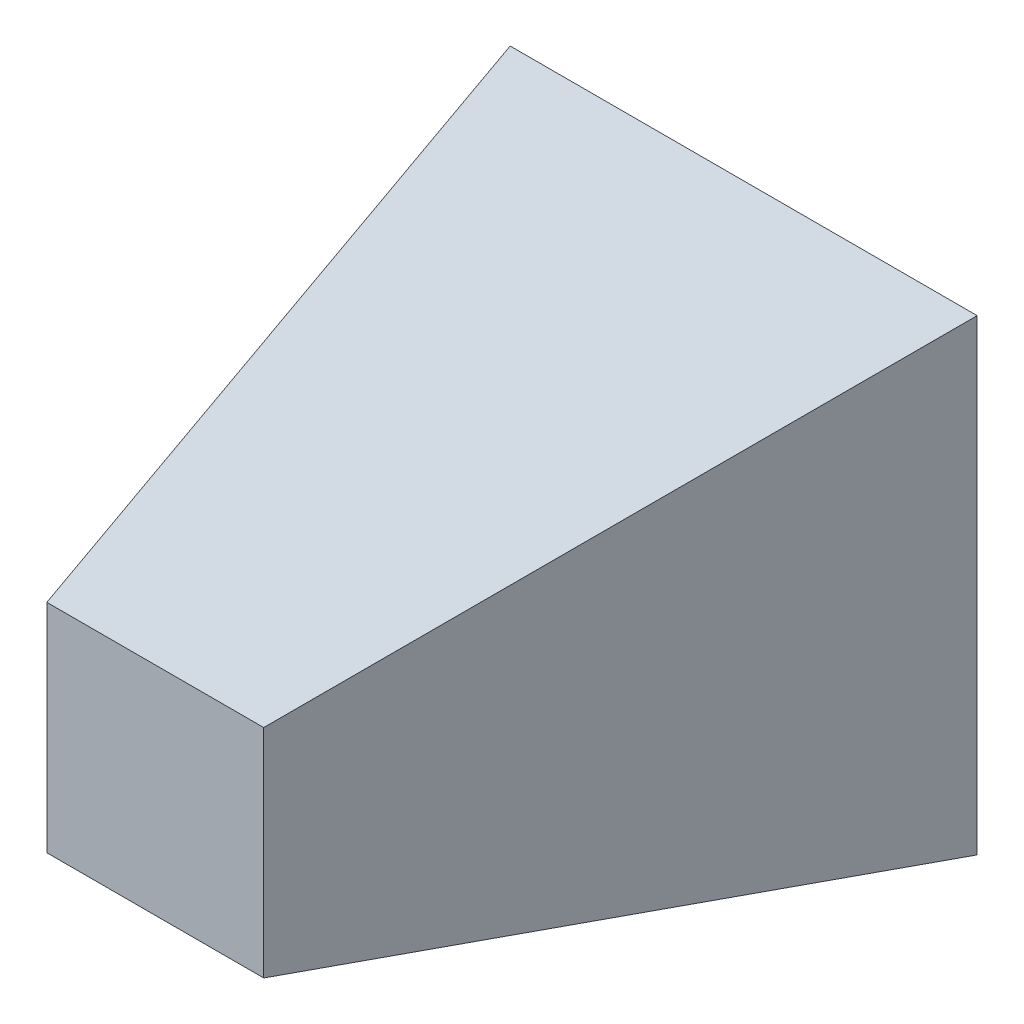
ISO-10303-21;
HEADER;
FILE_DESCRIPTION(('STEP AP214'),'2;1');
FILE_NAME('part.step','',(''),(''),'','','');
FILE_SCHEMA(('AUTOMOTIVE_DESIGN { 1 0 10303 214 1 1 1 1 }'));
ENDSEC;
DATA;
#1=APPLICATION_CONTEXT('core data for automotive mechanical design processes');
#2=APPLICATION_PROTOCOL_DEFINITION('international standard','automotive_design',2000,#1);
#3=PRODUCT_CONTEXT('',#1,'mechanical');
#4=PRODUCT('Part','Part','',(#3));
#5=PRODUCT_RELATED_PRODUCT_CATEGORY('part','',(#4));
#6=PRODUCT_DEFINITION_FORMATION('','',#4);
#7=PRODUCT_DEFINITION_CONTEXT('part definition',#1,'design');
#8=PRODUCT_DEFINITION('design','',#6,#7);
#9=PRODUCT_DEFINITION_SHAPE('','',#8);
#10=(LENGTH_UNIT() NAMED_UNIT(*) SI_UNIT(.MILLI.,.METRE.));
#11=(NAMED_UNIT(*) PLANE_ANGLE_UNIT() SI_UNIT($,.RADIAN.));
#12=(NAMED_UNIT(*) SI_UNIT($,.STERADIAN.) SOLID_ANGLE_UNIT());
#13=UNCERTAINTY_MEASURE_WITH_UNIT(LENGTH_MEASURE(1.E-05),#10,'distance_accuracy_value','');
#14=(GEOMETRIC_REPRESENTATION_CONTEXT(3) GLOBAL_UNCERTAINTY_ASSIGNED_CONTEXT((#13)) GLOBAL_UNIT_ASSIGNED_CONTEXT((#10,
#11,#12)) REPRESENTATION_CONTEXT('',''));
#15=CARTESIAN_POINT('',(0.,0.,0.));
#16=DIRECTION('',(0.,0.,1.));
#17=DIRECTION('',(1.,0.,0.));
#18=AXIS2_PLACEMENT_3D('',#15,#16,#17);
#19=CARTESIAN_POINT('',(8.607,2.2275,-21.));
#20=DIRECTION('',(-0.978147600733806,0.,0.207911690817759));
#21=DIRECTION('',(0.207911690817759,0.,0.978147600733806));
#22=AXIS2_PLACEMENT_3D('',#19,#20,#21);
#23=PLANE('',#22);
#24=DIRECTION('',(0.,-1.,0.));
#25=VECTOR('',#24,1.);
#26=CARTESIAN_POINT('',(8.607,2.2275,-21.));
#27=LINE('',#26,#25);
#28=CARTESIAN_POINT('',(8.607,2.2275,-21.));
#29=VERTEX_POINT('',#28);
#30=CARTESIAN_POINT('',(8.607,1.5925,-21.));
#31=VERTEX_POINT('',#30);
#32=EDGE_CURVE('E11',#29,#31,#27,.T.);
#33=ORIENTED_EDGE('',*,*,#32,.T.);
#34=DIRECTION('',(-0.203558594952779,-0.203558594952779,-0.957667894857973));
#35=VECTOR('',#34,1.);
#36=CARTESIAN_POINT('',(8.607,1.5925,-21.));
#37=LINE('',#36,#35);
#38=CARTESIAN_POINT('',(8.77704524933602,1.76254524933602,-20.2));
#39=VERTEX_POINT('',#38);
#40=EDGE_CURVE('E24',#39,#31,#37,.T.);
#41=ORIENTED_EDGE('',*,*,#40,.F.);
#42=DIRECTION('',(0.,-1.,0.));
#43=VECTOR('',#42,1.);
#44=CARTESIAN_POINT('',(8.77704524933602,2.2275,-20.2));
#45=LINE('',#44,#43);
#46=CARTESIAN_POINT('',(8.77704524933602,2.05745475066398,-20.2));
#47=VERTEX_POINT('',#46);
#48=EDGE_CURVE('E88',#47,#39,#45,.T.);
#49=ORIENTED_EDGE('',*,*,#48,.F.);
#50=DIRECTION('',(-0.203558594952779,0.203558594952779,-0.957667894857973));
#51=VECTOR('',#50,1.);
#52=CARTESIAN_POINT('',(8.607,2.2275,-21.));
#53=LINE('',#52,#51);
#54=EDGE_CURVE('E77',#47,#29,#53,.T.);
#55=ORIENTED_EDGE('',*,*,#54,.T.);
#56=EDGE_LOOP('',(#33,#41,#49,#55));
#57=FACE_BOUND('',#56,.T.);
#58=ADVANCED_FACE('F17',(#57),#23,.T.);
#59=CARTESIAN_POINT('',(8.607,1.5925,-21.));
#60=DIRECTION('',(0.,-0.978147600733806,0.207911690817759));
#61=DIRECTION('',(0.,-0.207911690817759,-0.978147600733806));
#62=AXIS2_PLACEMENT_3D('',#59,#60,#61);
#63=PLANE('',#62);
#64=DIRECTION('',(1.,0.,0.));
#65=VECTOR('',#64,1.);
#66=CARTESIAN_POINT('',(8.607,1.5925,-21.));
#67=LINE('',#66,#65);
#68=CARTESIAN_POINT('',(9.242,1.5925,-21.));
#69=VERTEX_POINT('',#68);
#70=EDGE_CURVE('E85',#31,#69,#67,.T.);
#71=ORIENTED_EDGE('',*,*,#70,.T.);
#72=DIRECTION('',(0.203558594952779,-0.203558594952779,-0.957667894857973));
#73=VECTOR('',#72,1.);
#74=CARTESIAN_POINT('',(9.21568807549724,1.61881192450276,-20.876212127746));
#75=LINE('',#74,#73);
#76=CARTESIAN_POINT('',(9.07195475066398,1.76254524933602,-20.2));
#77=VERTEX_POINT('',#76);
#78=EDGE_CURVE('E83',#77,#69,#75,.T.);
#79=ORIENTED_EDGE('',*,*,#78,.F.);
#80=DIRECTION('',(1.,0.,0.));
#81=VECTOR('',#80,1.);
#82=CARTESIAN_POINT('',(8.607,1.76254524933602,-20.2));
#83=LINE('',#82,#81);
#84=EDGE_CURVE('E72',#39,#77,#83,.T.);
#85=ORIENTED_EDGE('',*,*,#84,.F.);
#86=ORIENTED_EDGE('',*,*,#40,.T.);
#87=EDGE_LOOP('',(#71,#79,#85,#86));
#88=FACE_BOUND('',#87,.T.);
#89=ADVANCED_FACE('F90',(#88),#63,.T.);
#90=CARTESIAN_POINT('',(9.242,2.2275,-21.));
#91=DIRECTION('',(0.978147600733806,0.,0.207911690817759));
#92=DIRECTION('',(0.207911690817759,0.,-0.978147600733806));
#93=AXIS2_PLACEMENT_3D('',#90,#91,#92);
#94=PLANE('',#93);
#95=DIRECTION('',(0.,1.,0.));
#96=VECTOR('',#95,1.);
#97=CARTESIAN_POINT('',(9.242,2.2275,-21.));
#98=LINE('',#97,#96);
#99=CARTESIAN_POINT('',(9.242,2.2275,-21.));
#100=VERTEX_POINT('',#99);
#101=EDGE_CURVE('E60',#69,#100,#98,.T.);
#102=ORIENTED_EDGE('',*,*,#101,.T.);
#103=DIRECTION('',(0.203558594952779,0.203558594952779,-0.957667894857973));
#104=VECTOR('',#103,1.);
#105=CARTESIAN_POINT('',(9.21568807549724,2.20118807549724,-20.876212127746));
#106=LINE('',#105,#104);
#107=CARTESIAN_POINT('',(9.07195475066398,2.05745475066398,-20.2));
#108=VERTEX_POINT('',#107);
#109=EDGE_CURVE('E54',#108,#100,#106,.T.);
#110=ORIENTED_EDGE('',*,*,#109,.F.);
#111=DIRECTION('',(0.,1.,0.));
#112=VECTOR('',#111,1.);
#113=CARTESIAN_POINT('',(9.07195475066398,2.2275,-20.2));
#114=LINE('',#113,#112);
#115=EDGE_CURVE('E58',#77,#108,#114,.T.);
#116=ORIENTED_EDGE('',*,*,#115,.F.);
#117=ORIENTED_EDGE('',*,*,#78,.T.);
#118=EDGE_LOOP('',(#102,#110,#116,#117));
#119=FACE_BOUND('',#118,.T.);
#120=ADVANCED_FACE('F56',(#119),#94,.T.);
#121=CARTESIAN_POINT('',(8.607,2.2275,-21.));
#122=DIRECTION('',(0.,0.978147600733806,0.207911690817759));
#123=DIRECTION('',(0.,-0.207911690817759,0.978147600733806));
#124=AXIS2_PLACEMENT_3D('',#121,#122,#123);
#125=PLANE('',#124);
#126=DIRECTION('',(-1.,0.,0.));
#127=VECTOR('',#126,1.);
#128=CARTESIAN_POINT('',(8.607,2.2275,-21.));
#129=LINE('',#128,#127);
#130=EDGE_CURVE('E73',#100,#29,#129,.T.);
#131=ORIENTED_EDGE('',*,*,#130,.T.);
#132=ORIENTED_EDGE('',*,*,#54,.F.);
#133=DIRECTION('',(-1.,0.,0.));
#134=VECTOR('',#133,1.);
#135=CARTESIAN_POINT('',(8.607,2.05745475066398,-20.2));
#136=LINE('',#135,#134);
#137=EDGE_CURVE('E70',#108,#47,#136,.T.);
#138=ORIENTED_EDGE('',*,*,#137,.F.);
#139=ORIENTED_EDGE('',*,*,#109,.T.);
#140=EDGE_LOOP('',(#131,#132,#138,#139));
#141=FACE_BOUND('',#140,.T.);
#142=ADVANCED_FACE('F76',(#141),#125,.T.);
#143=CARTESIAN_POINT('',(0.,0.,-20.2));
#144=DIRECTION('',(0.,0.,1.));
#145=DIRECTION('',(1.,0.,0.));
#146=AXIS2_PLACEMENT_3D('',#143,#144,#145);
#147=PLANE('',#146);
#148=ORIENTED_EDGE('',*,*,#48,.T.);
#149=ORIENTED_EDGE('',*,*,#84,.T.);
#150=ORIENTED_EDGE('',*,*,#115,.T.);
#151=ORIENTED_EDGE('',*,*,#137,.T.);
#152=EDGE_LOOP('',(#148,#149,#150,#151));
#153=FACE_BOUND('',#152,.T.);
#154=ADVANCED_FACE('F69',(#153),#147,.T.);
#155=CARTESIAN_POINT('',(0.,0.,-21.));
#156=DIRECTION('',(0.,0.,1.));
#157=DIRECTION('',(1.,0.,0.));
#158=AXIS2_PLACEMENT_3D('',#155,#156,#157);
#159=PLANE('',#158);
#160=ORIENTED_EDGE('',*,*,#32,.F.);
#161=ORIENTED_EDGE('',*,*,#130,.F.);
#162=ORIENTED_EDGE('',*,*,#101,.F.);
#163=ORIENTED_EDGE('',*,*,#70,.F.);
#164=EDGE_LOOP('',(#160,#161,#162,#163));
#165=FACE_BOUND('',#164,.T.);
#166=ADVANCED_FACE('F91',(#165),#159,.F.);
#167=CLOSED_SHELL('',(#58,#89,#120,#142,#154,#166));
#168=MANIFOLD_SOLID_BREP('B1',#167);
#169=ADVANCED_BREP_SHAPE_REPRESENTATION('',(#18,#168),#14);
#170=SHAPE_DEFINITION_REPRESENTATION(#9,#169);
ENDSEC;
END-ISO-10303-21;
